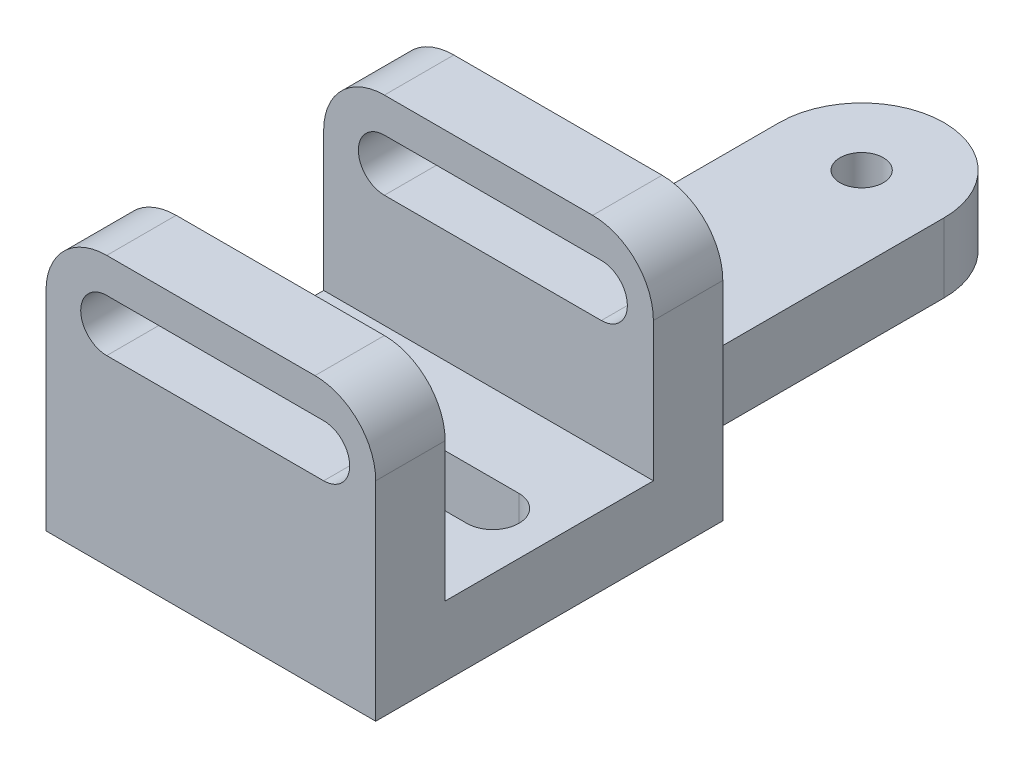
ISO-10303-21;
HEADER;
FILE_DESCRIPTION(('STEP AP214'),'2;1');
FILE_NAME('part.step','',(''),(''),'','','');
FILE_SCHEMA(('AUTOMOTIVE_DESIGN { 1 0 10303 214 1 1 1 1 }'));
ENDSEC;
DATA;
#1=APPLICATION_CONTEXT('core data for automotive mechanical design processes');
#2=APPLICATION_PROTOCOL_DEFINITION('international standard','automotive_design',2000,#1);
#3=PRODUCT_CONTEXT('',#1,'mechanical');
#4=PRODUCT('Part','Part','',(#3));
#5=PRODUCT_RELATED_PRODUCT_CATEGORY('part','',(#4));
#6=PRODUCT_DEFINITION_FORMATION('','',#4);
#7=PRODUCT_DEFINITION_CONTEXT('part definition',#1,'design');
#8=PRODUCT_DEFINITION('design','',#6,#7);
#9=PRODUCT_DEFINITION_SHAPE('','',#8);
#10=(LENGTH_UNIT() NAMED_UNIT(*) SI_UNIT(.MILLI.,.METRE.));
#11=(NAMED_UNIT(*) PLANE_ANGLE_UNIT() SI_UNIT($,.RADIAN.));
#12=(NAMED_UNIT(*) SI_UNIT($,.STERADIAN.) SOLID_ANGLE_UNIT());
#13=UNCERTAINTY_MEASURE_WITH_UNIT(LENGTH_MEASURE(1.E-05),#10,'distance_accuracy_value','');
#14=(GEOMETRIC_REPRESENTATION_CONTEXT(3) GLOBAL_UNCERTAINTY_ASSIGNED_CONTEXT((#13)) GLOBAL_UNIT_ASSIGNED_CONTEXT((#10,
#11,#12)) REPRESENTATION_CONTEXT('',''));
#15=CARTESIAN_POINT('',(0.,0.,0.));
#16=DIRECTION('',(0.,0.,1.));
#17=DIRECTION('',(1.,0.,0.));
#18=AXIS2_PLACEMENT_3D('',#15,#16,#17);
#19=CARTESIAN_POINT('',(38.,0.,-80.));
#20=DIRECTION('',(0.,0.,1.));
#21=DIRECTION('',(0.,-1.,0.));
#22=AXIS2_PLACEMENT_3D('',#19,#20,#21);
#23=PLANE('',#22);
#24=DIRECTION('',(-1.,0.,0.));
#25=VECTOR('',#24,1.);
#26=CARTESIAN_POINT('',(38.,54.,-80.));
#27=LINE('',#26,#25);
#28=CARTESIAN_POINT('',(26.,54.,-80.));
#29=VERTEX_POINT('',#28);
#30=CARTESIAN_POINT('',(-24.,54.,-80.));
#31=VERTEX_POINT('',#30);
#32=EDGE_CURVE('E312',#29,#31,#27,.T.);
#33=ORIENTED_EDGE('',*,*,#32,.T.);
#34=CARTESIAN_POINT('',(-24.,48.,-80.));
#35=DIRECTION('',(0.,0.,1.));
#36=DIRECTION('',(0.,-1.,0.));
#37=AXIS2_PLACEMENT_3D('',#34,#35,#36);
#38=CIRCLE('',#37,6.);
#39=CARTESIAN_POINT('',(-24.,42.,-80.));
#40=VERTEX_POINT('',#39);
#41=EDGE_CURVE('E320',#31,#40,#38,.T.);
#42=ORIENTED_EDGE('',*,*,#41,.T.);
#43=DIRECTION('',(1.,0.,0.));
#44=VECTOR('',#43,1.);
#45=CARTESIAN_POINT('',(38.,42.,-80.));
#46=LINE('',#45,#44);
#47=CARTESIAN_POINT('',(26.,42.,-80.));
#48=VERTEX_POINT('',#47);
#49=EDGE_CURVE('E296',#40,#48,#46,.T.);
#50=ORIENTED_EDGE('',*,*,#49,.T.);
#51=CARTESIAN_POINT('',(26.,48.,-80.));
#52=DIRECTION('',(0.,0.,1.));
#53=DIRECTION('',(0.,-1.,0.));
#54=AXIS2_PLACEMENT_3D('',#51,#52,#53);
#55=CIRCLE('',#54,6.);
#56=EDGE_CURVE('E304',#48,#29,#55,.T.);
#57=ORIENTED_EDGE('',*,*,#56,.T.);
#58=EDGE_LOOP('',(#33,#42,#50,#57));
#59=FACE_BOUND('',#58,.T.);
#60=DIRECTION('',(-1.,0.,0.));
#61=VECTOR('',#60,1.);
#62=CARTESIAN_POINT('',(-19.,16.,-80.));
#63=LINE('',#62,#61);
#64=CARTESIAN_POINT('',(33.,16.,-80.));
#65=VERTEX_POINT('',#64);
#66=CARTESIAN_POINT('',(-33.,16.,-80.));
#67=VERTEX_POINT('',#66);
#68=EDGE_CURVE('E368',#65,#67,#63,.T.);
#69=ORIENTED_EDGE('',*,*,#68,.T.);
#70=DIRECTION('',(0.,-1.,0.));
#71=VECTOR('',#70,1.);
#72=CARTESIAN_POINT('',(-33.,0.,-80.));
#73=LINE('',#72,#71);
#74=CARTESIAN_POINT('',(-33.,0.,-80.));
#75=VERTEX_POINT('',#74);
#76=EDGE_CURVE('E551',#67,#75,#73,.T.);
#77=ORIENTED_EDGE('',*,*,#76,.T.);
#78=DIRECTION('',(-1.,0.,0.));
#79=VECTOR('',#78,1.);
#80=CARTESIAN_POINT('',(38.,0.,-80.));
#81=LINE('',#80,#79);
#82=CARTESIAN_POINT('',(-38.,0.,-80.));
#83=VERTEX_POINT('',#82);
#84=EDGE_CURVE('E445',#75,#83,#81,.T.);
#85=ORIENTED_EDGE('',*,*,#84,.T.);
#86=DIRECTION('',(0.,1.,0.));
#87=VECTOR('',#86,1.);
#88=CARTESIAN_POINT('',(-38.,0.,-80.));
#89=LINE('',#88,#87);
#90=CARTESIAN_POINT('',(-38.,48.,-80.));
#91=VERTEX_POINT('',#90);
#92=EDGE_CURVE('E413',#83,#91,#89,.T.);
#93=ORIENTED_EDGE('',*,*,#92,.T.);
#94=CARTESIAN_POINT('',(-24.,48.,-80.));
#95=DIRECTION('',(0.,0.,1.));
#96=DIRECTION('',(0.,-1.,0.));
#97=AXIS2_PLACEMENT_3D('',#94,#95,#96);
#98=CIRCLE('',#97,14.);
#99=CARTESIAN_POINT('',(-24.,62.,-80.));
#100=VERTEX_POINT('',#99);
#101=EDGE_CURVE('E504',#91,#100,#98,.F.);
#102=ORIENTED_EDGE('',*,*,#101,.T.);
#103=DIRECTION('',(-1.,0.,0.));
#104=VECTOR('',#103,1.);
#105=CARTESIAN_POINT('',(38.,62.,-80.));
#106=LINE('',#105,#104);
#107=CARTESIAN_POINT('',(24.,62.,-80.));
#108=VERTEX_POINT('',#107);
#109=EDGE_CURVE('E441',#108,#100,#106,.T.);
#110=ORIENTED_EDGE('',*,*,#109,.F.);
#111=CARTESIAN_POINT('',(24.,48.,-80.));
#112=DIRECTION('',(0.,0.,1.));
#113=DIRECTION('',(0.,-1.,0.));
#114=AXIS2_PLACEMENT_3D('',#111,#112,#113);
#115=CIRCLE('',#114,14.);
#116=CARTESIAN_POINT('',(38.,48.,-80.));
#117=VERTEX_POINT('',#116);
#118=EDGE_CURVE('E501',#108,#117,#115,.F.);
#119=ORIENTED_EDGE('',*,*,#118,.T.);
#120=DIRECTION('',(0.,1.,0.));
#121=VECTOR('',#120,1.);
#122=CARTESIAN_POINT('',(38.,0.,-80.));
#123=LINE('',#122,#121);
#124=CARTESIAN_POINT('',(38.,0.,-80.));
#125=VERTEX_POINT('',#124);
#126=EDGE_CURVE('E392',#125,#117,#123,.T.);
#127=ORIENTED_EDGE('',*,*,#126,.F.);
#128=CARTESIAN_POINT('',(33.,0.,-80.));
#129=VERTEX_POINT('',#128);
#130=EDGE_CURVE('E446',#125,#129,#81,.T.);
#131=ORIENTED_EDGE('',*,*,#130,.T.);
#132=DIRECTION('',(0.,-1.,0.));
#133=VECTOR('',#132,1.);
#134=CARTESIAN_POINT('',(33.,0.,-80.));
#135=LINE('',#134,#133);
#136=EDGE_CURVE('E547',#129,#65,#135,.F.);
#137=ORIENTED_EDGE('',*,*,#136,.T.);
#138=EDGE_LOOP('',(#69,#77,#85,#93,#102,#110,#119,#127,#131,#137));
#139=FACE_BOUND('',#138,.T.);
#140=ADVANCED_FACE('F43',(#59,#139),#23,.F.);
#141=CARTESIAN_POINT('',(38.,62.,-16.));
#142=DIRECTION('',(0.,-1.,0.));
#143=DIRECTION('',(0.,0.,-1.));
#144=AXIS2_PLACEMENT_3D('',#141,#142,#143);
#145=PLANE('',#144);
#146=DIRECTION('',(-1.,0.,0.));
#147=VECTOR('',#146,1.);
#148=CARTESIAN_POINT('',(38.,62.,-16.));
#149=LINE('',#148,#147);
#150=CARTESIAN_POINT('',(24.,62.,-16.));
#151=VERTEX_POINT('',#150);
#152=CARTESIAN_POINT('',(-24.,62.,-16.));
#153=VERTEX_POINT('',#152);
#154=EDGE_CURVE('E406',#151,#153,#149,.T.);
#155=ORIENTED_EDGE('',*,*,#154,.T.);
#156=DIRECTION('',(0.,0.,1.));
#157=VECTOR('',#156,1.);
#158=CARTESIAN_POINT('',(-24.,62.,-16.));
#159=LINE('',#158,#157);
#160=CARTESIAN_POINT('',(-24.,62.,0.));
#161=VERTEX_POINT('',#160);
#162=EDGE_CURVE('E510',#153,#161,#159,.T.);
#163=ORIENTED_EDGE('',*,*,#162,.T.);
#164=DIRECTION('',(-1.,0.,0.));
#165=VECTOR('',#164,1.);
#166=CARTESIAN_POINT('',(38.,62.,0.));
#167=LINE('',#166,#165);
#168=CARTESIAN_POINT('',(24.,62.,0.));
#169=VERTEX_POINT('',#168);
#170=EDGE_CURVE('E454',#169,#161,#167,.T.);
#171=ORIENTED_EDGE('',*,*,#170,.F.);
#172=DIRECTION('',(0.,0.,1.));
#173=VECTOR('',#172,1.);
#174=CARTESIAN_POINT('',(24.,62.,-16.));
#175=LINE('',#174,#173);
#176=EDGE_CURVE('E507',#169,#151,#175,.F.);
#177=ORIENTED_EDGE('',*,*,#176,.T.);
#178=EDGE_LOOP('',(#155,#163,#171,#177));
#179=FACE_BOUND('',#178,.T.);
#180=ADVANCED_FACE('F626',(#179),#145,.F.);
#181=CARTESIAN_POINT('',(38.,62.,0.));
#182=DIRECTION('',(0.,0.,-1.));
#183=DIRECTION('',(-1.,0.,0.));
#184=AXIS2_PLACEMENT_3D('',#181,#182,#183);
#185=PLANE('',#184);
#186=DIRECTION('',(1.,0.,0.));
#187=VECTOR('',#186,1.);
#188=CARTESIAN_POINT('',(-24.,42.,0.));
#189=LINE('',#188,#187);
#190=CARTESIAN_POINT('',(-24.,42.,0.));
#191=VERTEX_POINT('',#190);
#192=CARTESIAN_POINT('',(26.,42.,0.));
#193=VERTEX_POINT('',#192);
#194=EDGE_CURVE('E263',#191,#193,#189,.T.);
#195=ORIENTED_EDGE('',*,*,#194,.F.);
#196=CARTESIAN_POINT('',(-24.,48.,0.));
#197=DIRECTION('',(0.,0.,1.));
#198=DIRECTION('',(1.,0.,0.));
#199=AXIS2_PLACEMENT_3D('',#196,#197,#198);
#200=CIRCLE('',#199,6.);
#201=CARTESIAN_POINT('',(-24.,54.,0.));
#202=VERTEX_POINT('',#201);
#203=EDGE_CURVE('E270',#202,#191,#200,.T.);
#204=ORIENTED_EDGE('',*,*,#203,.F.);
#205=DIRECTION('',(-1.,0.,0.));
#206=VECTOR('',#205,1.);
#207=CARTESIAN_POINT('',(-24.,54.,0.));
#208=LINE('',#207,#206);
#209=CARTESIAN_POINT('',(26.,54.,0.));
#210=VERTEX_POINT('',#209);
#211=EDGE_CURVE('E275',#210,#202,#208,.T.);
#212=ORIENTED_EDGE('',*,*,#211,.F.);
#213=CARTESIAN_POINT('',(26.,48.,0.));
#214=DIRECTION('',(0.,0.,1.));
#215=DIRECTION('',(1.,0.,0.));
#216=AXIS2_PLACEMENT_3D('',#213,#214,#215);
#217=CIRCLE('',#216,6.);
#218=EDGE_CURVE('E251',#193,#210,#217,.T.);
#219=ORIENTED_EDGE('',*,*,#218,.F.);
#220=EDGE_LOOP('',(#195,#204,#212,#219));
#221=FACE_BOUND('',#220,.T.);
#222=ORIENTED_EDGE('',*,*,#170,.T.);
#223=CARTESIAN_POINT('',(-24.,48.,0.));
#224=DIRECTION('',(0.,0.,-1.));
#225=DIRECTION('',(-1.,0.,0.));
#226=AXIS2_PLACEMENT_3D('',#223,#224,#225);
#227=CIRCLE('',#226,14.);
#228=CARTESIAN_POINT('',(-38.,48.,0.));
#229=VERTEX_POINT('',#228);
#230=EDGE_CURVE('E517',#161,#229,#227,.F.);
#231=ORIENTED_EDGE('',*,*,#230,.T.);
#232=DIRECTION('',(0.,-1.,0.));
#233=VECTOR('',#232,1.);
#234=CARTESIAN_POINT('',(-38.,62.,0.));
#235=LINE('',#234,#233);
#236=CARTESIAN_POINT('',(-38.,0.,0.));
#237=VERTEX_POINT('',#236);
#238=EDGE_CURVE('E378',#229,#237,#235,.T.);
#239=ORIENTED_EDGE('',*,*,#238,.T.);
#240=DIRECTION('',(-1.,0.,0.));
#241=VECTOR('',#240,1.);
#242=CARTESIAN_POINT('',(38.,0.,0.));
#243=LINE('',#242,#241);
#244=CARTESIAN_POINT('',(38.,0.,0.));
#245=VERTEX_POINT('',#244);
#246=EDGE_CURVE('E450',#245,#237,#243,.T.);
#247=ORIENTED_EDGE('',*,*,#246,.F.);
#248=DIRECTION('',(0.,-1.,0.));
#249=VECTOR('',#248,1.);
#250=CARTESIAN_POINT('',(38.,62.,0.));
#251=LINE('',#250,#249);
#252=CARTESIAN_POINT('',(38.,48.,0.));
#253=VERTEX_POINT('',#252);
#254=EDGE_CURVE('E385',#253,#245,#251,.T.);
#255=ORIENTED_EDGE('',*,*,#254,.F.);
#256=CARTESIAN_POINT('',(24.,48.,0.));
#257=DIRECTION('',(0.,0.,-1.));
#258=DIRECTION('',(-1.,0.,0.));
#259=AXIS2_PLACEMENT_3D('',#256,#257,#258);
#260=CIRCLE('',#259,14.);
#261=EDGE_CURVE('E514',#253,#169,#260,.F.);
#262=ORIENTED_EDGE('',*,*,#261,.T.);
#263=EDGE_LOOP('',(#222,#231,#239,#247,#255,#262));
#264=FACE_BOUND('',#263,.T.);
#265=ADVANCED_FACE('F272',(#221,#264),#185,.F.);
#266=CARTESIAN_POINT('',(38.,0.,0.));
#267=DIRECTION('',(0.,1.,0.));
#268=DIRECTION('',(0.,0.,1.));
#269=AXIS2_PLACEMENT_3D('',#266,#267,#268);
#270=PLANE('',#269);
#271=CARTESIAN_POINT('',(0.,0.,-150.));
#272=DIRECTION('',(0.,1.,0.));
#273=DIRECTION('',(0.,0.,1.));
#274=AXIS2_PLACEMENT_3D('',#271,#272,#273);
#275=CIRCLE('',#274,5.);
#276=CARTESIAN_POINT('',(0.,0.,-145.));
#277=VERTEX_POINT('',#276);
#278=EDGE_CURVE('E1031',#277,#277,#275,.T.);
#279=ORIENTED_EDGE('',*,*,#278,.T.);
#280=EDGE_LOOP('',(#279));
#281=FACE_BOUND('',#280,.T.);
#282=DIRECTION('',(-1.,0.,0.));
#283=VECTOR('',#282,1.);
#284=CARTESIAN_POINT('',(25.,0.,-34.));
#285=LINE('',#284,#283);
#286=CARTESIAN_POINT('',(25.,0.,-34.));
#287=VERTEX_POINT('',#286);
#288=CARTESIAN_POINT('',(-25.,0.,-34.));
#289=VERTEX_POINT('',#288);
#290=EDGE_CURVE('E327',#287,#289,#285,.T.);
#291=ORIENTED_EDGE('',*,*,#290,.F.);
#292=CARTESIAN_POINT('',(25.,0.,-40.));
#293=DIRECTION('',(0.,1.,0.));
#294=DIRECTION('',(0.,0.,1.));
#295=AXIS2_PLACEMENT_3D('',#292,#293,#294);
#296=CIRCLE('',#295,6.);
#297=CARTESIAN_POINT('',(25.,0.,-46.));
#298=VERTEX_POINT('',#297);
#299=EDGE_CURVE('E331',#298,#287,#296,.F.);
#300=ORIENTED_EDGE('',*,*,#299,.F.);
#301=DIRECTION('',(1.,0.,0.));
#302=VECTOR('',#301,1.);
#303=CARTESIAN_POINT('',(25.,0.,-46.));
#304=LINE('',#303,#302);
#305=CARTESIAN_POINT('',(-25.,0.,-46.));
#306=VERTEX_POINT('',#305);
#307=EDGE_CURVE('E354',#306,#298,#304,.T.);
#308=ORIENTED_EDGE('',*,*,#307,.F.);
#309=CARTESIAN_POINT('',(-25.,0.,-40.));
#310=DIRECTION('',(0.,1.,0.));
#311=DIRECTION('',(0.,0.,1.));
#312=AXIS2_PLACEMENT_3D('',#309,#310,#311);
#313=CIRCLE('',#312,5.99999999999999);
#314=EDGE_CURVE('E324',#289,#306,#313,.F.);
#315=ORIENTED_EDGE('',*,*,#314,.F.);
#316=EDGE_LOOP('',(#291,#300,#308,#315));
#317=FACE_BOUND('',#316,.T.);
#318=CARTESIAN_POINT('',(0.,0.,-150.));
#319=DIRECTION('',(0.,1.,0.));
#320=DIRECTION('',(0.,0.,1.));
#321=AXIS2_PLACEMENT_3D('',#318,#319,#320);
#322=CIRCLE('',#321,19.);
#323=CARTESIAN_POINT('',(-19.,0.,-150.));
#324=VERTEX_POINT('',#323);
#325=CARTESIAN_POINT('',(0.,0.,-169.));
#326=VERTEX_POINT('',#325);
#327=EDGE_CURVE('E458',#324,#326,#322,.F.);
#328=ORIENTED_EDGE('',*,*,#327,.T.);
#329=CARTESIAN_POINT('',(0.,0.,-150.));
#330=DIRECTION('',(0.,1.,0.));
#331=DIRECTION('',(0.,0.,1.));
#332=AXIS2_PLACEMENT_3D('',#329,#330,#331);
#333=CIRCLE('',#332,19.);
#334=CARTESIAN_POINT('',(19.,0.,-150.));
#335=VERTEX_POINT('',#334);
#336=EDGE_CURVE('E461',#326,#335,#333,.F.);
#337=ORIENTED_EDGE('',*,*,#336,.T.);
#338=DIRECTION('',(0.,0.,1.));
#339=VECTOR('',#338,1.);
#340=CARTESIAN_POINT('',(19.,0.,-80.));
#341=LINE('',#340,#339);
#342=CARTESIAN_POINT('',(19.,0.,-94.));
#343=VERTEX_POINT('',#342);
#344=EDGE_CURVE('E372',#335,#343,#341,.T.);
#345=ORIENTED_EDGE('',*,*,#344,.T.);
#346=CARTESIAN_POINT('',(33.,0.,-94.));
#347=DIRECTION('',(0.,1.,0.));
#348=DIRECTION('',(0.,0.,1.));
#349=AXIS2_PLACEMENT_3D('',#346,#347,#348);
#350=CIRCLE('',#349,14.);
#351=EDGE_CURVE('E52',#343,#129,#350,.T.);
#352=ORIENTED_EDGE('',*,*,#351,.T.);
#353=ORIENTED_EDGE('',*,*,#130,.F.);
#354=DIRECTION('',(0.,0.,-1.));
#355=VECTOR('',#354,1.);
#356=CARTESIAN_POINT('',(38.,0.,0.));
#357=LINE('',#356,#355);
#358=EDGE_CURVE('E388',#245,#125,#357,.T.);
#359=ORIENTED_EDGE('',*,*,#358,.F.);
#360=ORIENTED_EDGE('',*,*,#246,.T.);
#361=DIRECTION('',(0.,0.,-1.));
#362=VECTOR('',#361,1.);
#363=CARTESIAN_POINT('',(-38.,0.,0.));
#364=LINE('',#363,#362);
#365=EDGE_CURVE('E409',#237,#83,#364,.T.);
#366=ORIENTED_EDGE('',*,*,#365,.T.);
#367=ORIENTED_EDGE('',*,*,#84,.F.);
#368=CARTESIAN_POINT('',(-33.,0.,-94.));
#369=DIRECTION('',(0.,1.,0.));
#370=DIRECTION('',(0.,0.,1.));
#371=AXIS2_PLACEMENT_3D('',#368,#369,#370);
#372=CIRCLE('',#371,14.);
#373=CARTESIAN_POINT('',(-19.,0.,-94.));
#374=VERTEX_POINT('',#373);
#375=EDGE_CURVE('E561',#75,#374,#372,.T.);
#376=ORIENTED_EDGE('',*,*,#375,.T.);
#377=DIRECTION('',(0.,0.,-1.));
#378=VECTOR('',#377,1.);
#379=CARTESIAN_POINT('',(-19.,0.,-80.));
#380=LINE('',#379,#378);
#381=EDGE_CURVE('E379',#374,#324,#380,.T.);
#382=ORIENTED_EDGE('',*,*,#381,.T.);
#383=EDGE_LOOP('',(#328,#337,#345,#352,#353,#359,#360,#366,#367,#376,#382));
#384=FACE_BOUND('',#383,.T.);
#385=ADVANCED_FACE('F570',(#281,#317,#384),#270,.F.);
#386=CARTESIAN_POINT('',(38.,62.,-80.));
#387=DIRECTION('',(0.,-1.,0.));
#388=DIRECTION('',(0.,0.,-1.));
#389=AXIS2_PLACEMENT_3D('',#386,#387,#388);
#390=PLANE('',#389);
#391=ORIENTED_EDGE('',*,*,#109,.T.);
#392=DIRECTION('',(0.,0.,1.));
#393=VECTOR('',#392,1.);
#394=CARTESIAN_POINT('',(-24.,62.,-80.));
#395=LINE('',#394,#393);
#396=CARTESIAN_POINT('',(-24.,62.,-64.));
#397=VERTEX_POINT('',#396);
#398=EDGE_CURVE('E485',#100,#397,#395,.T.);
#399=ORIENTED_EDGE('',*,*,#398,.T.);
#400=DIRECTION('',(-1.,0.,0.));
#401=VECTOR('',#400,1.);
#402=CARTESIAN_POINT('',(38.,62.,-64.));
#403=LINE('',#402,#401);
#404=CARTESIAN_POINT('',(24.,62.,-64.));
#405=VERTEX_POINT('',#404);
#406=EDGE_CURVE('E437',#405,#397,#403,.T.);
#407=ORIENTED_EDGE('',*,*,#406,.F.);
#408=DIRECTION('',(0.,0.,1.));
#409=VECTOR('',#408,1.);
#410=CARTESIAN_POINT('',(24.,62.,-80.));
#411=LINE('',#410,#409);
#412=EDGE_CURVE('E479',#405,#108,#411,.F.);
#413=ORIENTED_EDGE('',*,*,#412,.T.);
#414=EDGE_LOOP('',(#391,#399,#407,#413));
#415=FACE_BOUND('',#414,.T.);
#416=ADVANCED_FACE('F635',(#415),#390,.F.);
#417=CARTESIAN_POINT('',(38.,62.,-64.));
#418=DIRECTION('',(0.,0.,-1.));
#419=DIRECTION('',(-1.,0.,0.));
#420=AXIS2_PLACEMENT_3D('',#417,#418,#419);
#421=PLANE('',#420);
#422=DIRECTION('',(-1.,0.,0.));
#423=VECTOR('',#422,1.);
#424=CARTESIAN_POINT('',(38.,42.,-64.));
#425=LINE('',#424,#423);
#426=CARTESIAN_POINT('',(26.,42.,-64.));
#427=VERTEX_POINT('',#426);
#428=CARTESIAN_POINT('',(-24.,42.,-64.));
#429=VERTEX_POINT('',#428);
#430=EDGE_CURVE('E292',#427,#429,#425,.T.);
#431=ORIENTED_EDGE('',*,*,#430,.T.);
#432=CARTESIAN_POINT('',(-24.,48.,-64.));
#433=DIRECTION('',(0.,0.,-1.));
#434=DIRECTION('',(-1.,0.,0.));
#435=AXIS2_PLACEMENT_3D('',#432,#433,#434);
#436=CIRCLE('',#435,6.);
#437=CARTESIAN_POINT('',(-24.,54.,-64.));
#438=VERTEX_POINT('',#437);
#439=EDGE_CURVE('E316',#429,#438,#436,.T.);
#440=ORIENTED_EDGE('',*,*,#439,.T.);
#441=DIRECTION('',(1.,0.,0.));
#442=VECTOR('',#441,1.);
#443=CARTESIAN_POINT('',(38.,54.,-64.));
#444=LINE('',#443,#442);
#445=CARTESIAN_POINT('',(26.,54.,-64.));
#446=VERTEX_POINT('',#445);
#447=EDGE_CURVE('E308',#438,#446,#444,.T.);
#448=ORIENTED_EDGE('',*,*,#447,.T.);
#449=CARTESIAN_POINT('',(26.,48.,-64.));
#450=DIRECTION('',(0.,0.,-1.));
#451=DIRECTION('',(-1.,0.,0.));
#452=AXIS2_PLACEMENT_3D('',#449,#450,#451);
#453=CIRCLE('',#452,6.);
#454=EDGE_CURVE('E300',#446,#427,#453,.T.);
#455=ORIENTED_EDGE('',*,*,#454,.T.);
#456=EDGE_LOOP('',(#431,#440,#448,#455));
#457=FACE_BOUND('',#456,.T.);
#458=ORIENTED_EDGE('',*,*,#406,.T.);
#459=CARTESIAN_POINT('',(-24.,48.,-64.));
#460=DIRECTION('',(0.,0.,-1.));
#461=DIRECTION('',(-1.,0.,0.));
#462=AXIS2_PLACEMENT_3D('',#459,#460,#461);
#463=CIRCLE('',#462,14.);
#464=CARTESIAN_POINT('',(-38.,48.,-64.));
#465=VERTEX_POINT('',#464);
#466=EDGE_CURVE('E492',#397,#465,#463,.F.);
#467=ORIENTED_EDGE('',*,*,#466,.T.);
#468=DIRECTION('',(0.,-1.,0.));
#469=VECTOR('',#468,1.);
#470=CARTESIAN_POINT('',(-38.,62.,-64.));
#471=LINE('',#470,#469);
#472=CARTESIAN_POINT('',(-38.,16.,-64.));
#473=VERTEX_POINT('',#472);
#474=EDGE_CURVE('E417',#465,#473,#471,.T.);
#475=ORIENTED_EDGE('',*,*,#474,.T.);
#476=DIRECTION('',(-1.,0.,0.));
#477=VECTOR('',#476,1.);
#478=CARTESIAN_POINT('',(38.,16.,-64.));
#479=LINE('',#478,#477);
#480=CARTESIAN_POINT('',(38.,16.,-64.));
#481=VERTEX_POINT('',#480);
#482=EDGE_CURVE('E433',#481,#473,#479,.T.);
#483=ORIENTED_EDGE('',*,*,#482,.F.);
#484=DIRECTION('',(0.,-1.,0.));
#485=VECTOR('',#484,1.);
#486=CARTESIAN_POINT('',(38.,62.,-64.));
#487=LINE('',#486,#485);
#488=CARTESIAN_POINT('',(38.,48.,-64.));
#489=VERTEX_POINT('',#488);
#490=EDGE_CURVE('E396',#489,#481,#487,.T.);
#491=ORIENTED_EDGE('',*,*,#490,.F.);
#492=CARTESIAN_POINT('',(24.,48.,-64.));
#493=DIRECTION('',(0.,0.,-1.));
#494=DIRECTION('',(-1.,0.,0.));
#495=AXIS2_PLACEMENT_3D('',#492,#493,#494);
#496=CIRCLE('',#495,14.);
#497=EDGE_CURVE('E489',#489,#405,#496,.F.);
#498=ORIENTED_EDGE('',*,*,#497,.T.);
#499=EDGE_LOOP('',(#458,#467,#475,#483,#491,#498));
#500=FACE_BOUND('',#499,.T.);
#501=ADVANCED_FACE('F616',(#457,#500),#421,.F.);
#502=CARTESIAN_POINT('',(38.,16.,-64.));
#503=DIRECTION('',(0.,-1.,0.));
#504=DIRECTION('',(0.,0.,-1.));
#505=AXIS2_PLACEMENT_3D('',#502,#503,#504);
#506=PLANE('',#505);
#507=DIRECTION('',(-1.,0.,0.));
#508=VECTOR('',#507,1.);
#509=CARTESIAN_POINT('',(25.,16.,-46.));
#510=LINE('',#509,#508);
#511=CARTESIAN_POINT('',(25.,16.,-46.));
#512=VERTEX_POINT('',#511);
#513=CARTESIAN_POINT('',(-25.,16.,-46.));
#514=VERTEX_POINT('',#513);
#515=EDGE_CURVE('E338',#512,#514,#510,.T.);
#516=ORIENTED_EDGE('',*,*,#515,.F.);
#517=CARTESIAN_POINT('',(25.,16.,-40.));
#518=DIRECTION('',(0.,1.,0.));
#519=DIRECTION('',(0.,0.,1.));
#520=AXIS2_PLACEMENT_3D('',#517,#518,#519);
#521=CIRCLE('',#520,6.);
#522=CARTESIAN_POINT('',(25.,16.,-34.));
#523=VERTEX_POINT('',#522);
#524=EDGE_CURVE('E335',#523,#512,#521,.T.);
#525=ORIENTED_EDGE('',*,*,#524,.F.);
#526=DIRECTION('',(1.,0.,0.));
#527=VECTOR('',#526,1.);
#528=CARTESIAN_POINT('',(25.,16.,-34.));
#529=LINE('',#528,#527);
#530=CARTESIAN_POINT('',(-25.,16.,-34.));
#531=VERTEX_POINT('',#530);
#532=EDGE_CURVE('E346',#531,#523,#529,.T.);
#533=ORIENTED_EDGE('',*,*,#532,.F.);
#534=CARTESIAN_POINT('',(-25.,16.,-40.));
#535=DIRECTION('',(0.,1.,0.));
#536=DIRECTION('',(0.,0.,1.));
#537=AXIS2_PLACEMENT_3D('',#534,#535,#536);
#538=CIRCLE('',#537,5.99999999999999);
#539=EDGE_CURVE('E342',#514,#531,#538,.T.);
#540=ORIENTED_EDGE('',*,*,#539,.F.);
#541=EDGE_LOOP('',(#516,#525,#533,#540));
#542=FACE_BOUND('',#541,.T.);
#543=DIRECTION('',(0.,0.,1.));
#544=VECTOR('',#543,1.);
#545=CARTESIAN_POINT('',(-38.,16.,-64.));
#546=LINE('',#545,#544);
#547=CARTESIAN_POINT('',(-38.,16.,-16.));
#548=VERTEX_POINT('',#547);
#549=EDGE_CURVE('E420',#473,#548,#546,.T.);
#550=ORIENTED_EDGE('',*,*,#549,.T.);
#551=DIRECTION('',(-1.,0.,0.));
#552=VECTOR('',#551,1.);
#553=CARTESIAN_POINT('',(38.,16.,-16.));
#554=LINE('',#553,#552);
#555=CARTESIAN_POINT('',(38.,16.,-16.));
#556=VERTEX_POINT('',#555);
#557=EDGE_CURVE('E429',#556,#548,#554,.T.);
#558=ORIENTED_EDGE('',*,*,#557,.F.);
#559=DIRECTION('',(0.,0.,1.));
#560=VECTOR('',#559,1.);
#561=CARTESIAN_POINT('',(38.,16.,-64.));
#562=LINE('',#561,#560);
#563=EDGE_CURVE('E399',#481,#556,#562,.T.);
#564=ORIENTED_EDGE('',*,*,#563,.F.);
#565=ORIENTED_EDGE('',*,*,#482,.T.);
#566=EDGE_LOOP('',(#550,#558,#564,#565));
#567=FACE_BOUND('',#566,.T.);
#568=ADVANCED_FACE('F718',(#542,#567),#506,.F.);
#569=CARTESIAN_POINT('',(38.,16.,-16.));
#570=DIRECTION('',(0.,0.,1.));
#571=DIRECTION('',(0.,-1.,0.));
#572=AXIS2_PLACEMENT_3D('',#569,#570,#571);
#573=PLANE('',#572);
#574=DIRECTION('',(-1.,0.,0.));
#575=VECTOR('',#574,1.);
#576=CARTESIAN_POINT('',(38.,54.,-16.));
#577=LINE('',#576,#575);
#578=CARTESIAN_POINT('',(26.,54.,-16.));
#579=VERTEX_POINT('',#578);
#580=CARTESIAN_POINT('',(-24.,54.,-16.));
#581=VERTEX_POINT('',#580);
#582=EDGE_CURVE('E539',#579,#581,#577,.T.);
#583=ORIENTED_EDGE('',*,*,#582,.T.);
#584=CARTESIAN_POINT('',(-24.,48.,-16.));
#585=DIRECTION('',(0.,0.,1.));
#586=DIRECTION('',(0.,-1.,0.));
#587=AXIS2_PLACEMENT_3D('',#584,#585,#586);
#588=CIRCLE('',#587,6.);
#589=CARTESIAN_POINT('',(-24.,42.,-16.));
#590=VERTEX_POINT('',#589);
#591=EDGE_CURVE('E543',#581,#590,#588,.T.);
#592=ORIENTED_EDGE('',*,*,#591,.T.);
#593=DIRECTION('',(1.,0.,0.));
#594=VECTOR('',#593,1.);
#595=CARTESIAN_POINT('',(38.,42.,-16.));
#596=LINE('',#595,#594);
#597=CARTESIAN_POINT('',(26.,42.,-16.));
#598=VERTEX_POINT('',#597);
#599=EDGE_CURVE('E534',#590,#598,#596,.T.);
#600=ORIENTED_EDGE('',*,*,#599,.T.);
#601=CARTESIAN_POINT('',(26.,48.,-16.));
#602=DIRECTION('',(0.,0.,1.));
#603=DIRECTION('',(0.,-1.,0.));
#604=AXIS2_PLACEMENT_3D('',#601,#602,#603);
#605=CIRCLE('',#604,6.);
#606=EDGE_CURVE('E254',#598,#579,#605,.T.);
#607=ORIENTED_EDGE('',*,*,#606,.T.);
#608=EDGE_LOOP('',(#583,#592,#600,#607));
#609=FACE_BOUND('',#608,.T.);
#610=DIRECTION('',(0.,1.,0.));
#611=VECTOR('',#610,1.);
#612=CARTESIAN_POINT('',(-38.,16.,-16.));
#613=LINE('',#612,#611);
#614=CARTESIAN_POINT('',(-38.,48.,-16.));
#615=VERTEX_POINT('',#614);
#616=EDGE_CURVE('E389',#548,#615,#613,.T.);
#617=ORIENTED_EDGE('',*,*,#616,.T.);
#618=CARTESIAN_POINT('',(-24.,48.,-16.));
#619=DIRECTION('',(0.,0.,1.));
#620=DIRECTION('',(0.,-1.,0.));
#621=AXIS2_PLACEMENT_3D('',#618,#619,#620);
#622=CIRCLE('',#621,14.);
#623=EDGE_CURVE('E523',#615,#153,#622,.F.);
#624=ORIENTED_EDGE('',*,*,#623,.T.);
#625=ORIENTED_EDGE('',*,*,#154,.F.);
#626=CARTESIAN_POINT('',(24.,48.,-16.));
#627=DIRECTION('',(0.,0.,1.));
#628=DIRECTION('',(0.,-1.,0.));
#629=AXIS2_PLACEMENT_3D('',#626,#627,#628);
#630=CIRCLE('',#629,14.);
#631=CARTESIAN_POINT('',(38.,48.,-16.));
#632=VERTEX_POINT('',#631);
#633=EDGE_CURVE('E520',#151,#632,#630,.F.);
#634=ORIENTED_EDGE('',*,*,#633,.T.);
#635=DIRECTION('',(0.,1.,0.));
#636=VECTOR('',#635,1.);
#637=CARTESIAN_POINT('',(38.,16.,-16.));
#638=LINE('',#637,#636);
#639=EDGE_CURVE('E402',#556,#632,#638,.T.);
#640=ORIENTED_EDGE('',*,*,#639,.F.);
#641=ORIENTED_EDGE('',*,*,#557,.T.);
#642=EDGE_LOOP('',(#617,#624,#625,#634,#640,#641));
#643=FACE_BOUND('',#642,.T.);
#644=ADVANCED_FACE('F711',(#609,#643),#573,.F.);
#645=CARTESIAN_POINT('',(38.,0.,0.));
#646=DIRECTION('',(1.,0.,0.));
#647=DIRECTION('',(0.,0.,-1.));
#648=AXIS2_PLACEMENT_3D('',#645,#646,#647);
#649=PLANE('',#648);
#650=ORIENTED_EDGE('',*,*,#126,.T.);
#651=DIRECTION('',(0.,0.,1.));
#652=VECTOR('',#651,1.);
#653=CARTESIAN_POINT('',(38.,48.,-64.));
#654=LINE('',#653,#652);
#655=EDGE_CURVE('E530',#117,#489,#654,.T.);
#656=ORIENTED_EDGE('',*,*,#655,.T.);
#657=ORIENTED_EDGE('',*,*,#490,.T.);
#658=ORIENTED_EDGE('',*,*,#563,.T.);
#659=ORIENTED_EDGE('',*,*,#639,.T.);
#660=DIRECTION('',(0.,0.,1.));
#661=VECTOR('',#660,1.);
#662=CARTESIAN_POINT('',(38.,48.,0.));
#663=LINE('',#662,#661);
#664=EDGE_CURVE('E526',#632,#253,#663,.T.);
#665=ORIENTED_EDGE('',*,*,#664,.T.);
#666=ORIENTED_EDGE('',*,*,#254,.T.);
#667=ORIENTED_EDGE('',*,*,#358,.T.);
#668=EDGE_LOOP('',(#650,#656,#657,#658,#659,#665,#666,#667));
#669=FACE_BOUND('',#668,.T.);
#670=ADVANCED_FACE('F708',(#669),#649,.T.);
#671=CARTESIAN_POINT('',(-38.,0.,0.));
#672=DIRECTION('',(1.,0.,0.));
#673=DIRECTION('',(0.,0.,-1.));
#674=AXIS2_PLACEMENT_3D('',#671,#672,#673);
#675=PLANE('',#674);
#676=ORIENTED_EDGE('',*,*,#474,.F.);
#677=DIRECTION('',(0.,0.,1.));
#678=VECTOR('',#677,1.);
#679=CARTESIAN_POINT('',(-38.,48.,0.));
#680=LINE('',#679,#678);
#681=EDGE_CURVE('E498',#465,#91,#680,.F.);
#682=ORIENTED_EDGE('',*,*,#681,.T.);
#683=ORIENTED_EDGE('',*,*,#92,.F.);
#684=ORIENTED_EDGE('',*,*,#365,.F.);
#685=ORIENTED_EDGE('',*,*,#238,.F.);
#686=DIRECTION('',(0.,0.,1.));
#687=VECTOR('',#686,1.);
#688=CARTESIAN_POINT('',(-38.,48.,0.));
#689=LINE('',#688,#687);
#690=EDGE_CURVE('E495',#229,#615,#689,.F.);
#691=ORIENTED_EDGE('',*,*,#690,.T.);
#692=ORIENTED_EDGE('',*,*,#616,.F.);
#693=ORIENTED_EDGE('',*,*,#549,.F.);
#694=EDGE_LOOP('',(#676,#682,#683,#684,#685,#691,#692,#693));
#695=FACE_BOUND('',#694,.T.);
#696=ADVANCED_FACE('F705',(#695),#675,.F.);
#697=CARTESIAN_POINT('',(19.,16.,-80.));
#698=DIRECTION('',(1.,0.,0.));
#699=DIRECTION('',(0.,0.,-1.));
#700=AXIS2_PLACEMENT_3D('',#697,#698,#699);
#701=PLANE('',#700);
#702=DIRECTION('',(0.,0.,1.));
#703=VECTOR('',#702,1.);
#704=CARTESIAN_POINT('',(19.,16.,-80.));
#705=LINE('',#704,#703);
#706=CARTESIAN_POINT('',(19.,16.,-150.));
#707=VERTEX_POINT('',#706);
#708=CARTESIAN_POINT('',(19.,16.,-94.));
#709=VERTEX_POINT('',#708);
#710=EDGE_CURVE('E375',#707,#709,#705,.T.);
#711=ORIENTED_EDGE('',*,*,#710,.T.);
#712=DIRECTION('',(0.,-1.,0.));
#713=VECTOR('',#712,1.);
#714=CARTESIAN_POINT('',(19.,16.,-94.));
#715=LINE('',#714,#713);
#716=EDGE_CURVE('E558',#709,#343,#715,.T.);
#717=ORIENTED_EDGE('',*,*,#716,.T.);
#718=ORIENTED_EDGE('',*,*,#344,.F.);
#719=DIRECTION('',(0.,-1.,0.));
#720=VECTOR('',#719,1.);
#721=CARTESIAN_POINT('',(19.,16.,-150.));
#722=LINE('',#721,#720);
#723=EDGE_CURVE('E464',#335,#707,#722,.F.);
#724=ORIENTED_EDGE('',*,*,#723,.T.);
#725=EDGE_LOOP('',(#711,#717,#718,#724));
#726=FACE_BOUND('',#725,.T.);
#727=ADVANCED_FACE('F576',(#726),#701,.T.);
#728=CARTESIAN_POINT('',(-19.,16.,-80.));
#729=DIRECTION('',(-1.,0.,0.));
#730=DIRECTION('',(0.,0.,1.));
#731=AXIS2_PLACEMENT_3D('',#728,#729,#730);
#732=PLANE('',#731);
#733=ORIENTED_EDGE('',*,*,#381,.F.);
#734=DIRECTION('',(0.,-1.,0.));
#735=VECTOR('',#734,1.);
#736=CARTESIAN_POINT('',(-19.,16.,-94.));
#737=LINE('',#736,#735);
#738=CARTESIAN_POINT('',(-19.,16.,-94.));
#739=VERTEX_POINT('',#738);
#740=EDGE_CURVE('E555',#374,#739,#737,.F.);
#741=ORIENTED_EDGE('',*,*,#740,.T.);
#742=DIRECTION('',(0.,0.,-1.));
#743=VECTOR('',#742,1.);
#744=CARTESIAN_POINT('',(-19.,16.,-80.));
#745=LINE('',#744,#743);
#746=CARTESIAN_POINT('',(-19.,16.,-150.));
#747=VERTEX_POINT('',#746);
#748=EDGE_CURVE('E371',#739,#747,#745,.T.);
#749=ORIENTED_EDGE('',*,*,#748,.T.);
#750=DIRECTION('',(0.,-1.,0.));
#751=VECTOR('',#750,1.);
#752=CARTESIAN_POINT('',(-19.,16.,-150.));
#753=LINE('',#752,#751);
#754=EDGE_CURVE('E475',#747,#324,#753,.T.);
#755=ORIENTED_EDGE('',*,*,#754,.T.);
#756=EDGE_LOOP('',(#733,#741,#749,#755));
#757=FACE_BOUND('',#756,.T.);
#758=ADVANCED_FACE('F593',(#757),#732,.T.);
#759=CARTESIAN_POINT('',(0.,16.,0.));
#760=DIRECTION('',(0.,1.,0.));
#761=DIRECTION('',(0.,0.,1.));
#762=AXIS2_PLACEMENT_3D('',#759,#760,#761);
#763=PLANE('',#762);
#764=CARTESIAN_POINT('',(0.,16.,-150.));
#765=DIRECTION('',(0.,1.,0.));
#766=DIRECTION('',(0.,0.,1.));
#767=AXIS2_PLACEMENT_3D('',#764,#765,#766);
#768=CIRCLE('',#767,5.);
#769=CARTESIAN_POINT('',(0.,16.,-145.));
#770=VERTEX_POINT('',#769);
#771=EDGE_CURVE('E1034',#770,#770,#768,.T.);
#772=ORIENTED_EDGE('',*,*,#771,.F.);
#773=EDGE_LOOP('',(#772));
#774=FACE_BOUND('',#773,.T.);
#775=ORIENTED_EDGE('',*,*,#710,.F.);
#776=CARTESIAN_POINT('',(0.,16.,-150.));
#777=DIRECTION('',(0.,1.,0.));
#778=DIRECTION('',(0.,0.,1.));
#779=AXIS2_PLACEMENT_3D('',#776,#777,#778);
#780=CIRCLE('',#779,19.);
#781=CARTESIAN_POINT('',(0.,16.,-169.));
#782=VERTEX_POINT('',#781);
#783=EDGE_CURVE('E472',#707,#782,#780,.T.);
#784=ORIENTED_EDGE('',*,*,#783,.T.);
#785=CARTESIAN_POINT('',(0.,16.,-150.));
#786=DIRECTION('',(0.,1.,0.));
#787=DIRECTION('',(0.,0.,1.));
#788=AXIS2_PLACEMENT_3D('',#785,#786,#787);
#789=CIRCLE('',#788,19.);
#790=EDGE_CURVE('E468',#782,#747,#789,.T.);
#791=ORIENTED_EDGE('',*,*,#790,.T.);
#792=ORIENTED_EDGE('',*,*,#748,.F.);
#793=CARTESIAN_POINT('',(-33.,16.,-94.));
#794=DIRECTION('',(0.,1.,0.));
#795=DIRECTION('',(0.,0.,1.));
#796=AXIS2_PLACEMENT_3D('',#793,#794,#795);
#797=CIRCLE('',#796,14.);
#798=EDGE_CURVE('E564',#739,#67,#797,.F.);
#799=ORIENTED_EDGE('',*,*,#798,.T.);
#800=ORIENTED_EDGE('',*,*,#68,.F.);
#801=CARTESIAN_POINT('',(33.,16.,-94.));
#802=DIRECTION('',(0.,1.,0.));
#803=DIRECTION('',(0.,0.,1.));
#804=AXIS2_PLACEMENT_3D('',#801,#802,#803);
#805=CIRCLE('',#804,14.);
#806=EDGE_CURVE('E11',#65,#709,#805,.F.);
#807=ORIENTED_EDGE('',*,*,#806,.T.);
#808=EDGE_LOOP('',(#775,#784,#791,#792,#799,#800,#807));
#809=FACE_BOUND('',#808,.T.);
#810=ADVANCED_FACE('F578',(#774,#809),#763,.T.);
#811=CARTESIAN_POINT('',(0.,16.,-150.));
#812=DIRECTION('',(0.,-1.,0.));
#813=DIRECTION('',(0.,0.,-1.));
#814=AXIS2_PLACEMENT_3D('',#811,#812,#813);
#815=CYLINDRICAL_SURFACE('',#814,19.);
#816=ORIENTED_EDGE('',*,*,#754,.F.);
#817=ORIENTED_EDGE('',*,*,#790,.F.);
#818=DIRECTION('',(0.,-1.,0.));
#819=VECTOR('',#818,1.);
#820=CARTESIAN_POINT('',(0.,16.,-169.));
#821=LINE('',#820,#819);
#822=EDGE_CURVE('E367',#326,#782,#821,.F.);
#823=ORIENTED_EDGE('',*,*,#822,.F.);
#824=ORIENTED_EDGE('',*,*,#327,.F.);
#825=EDGE_LOOP('',(#816,#817,#823,#824));
#826=FACE_BOUND('',#825,.T.);
#827=ADVANCED_FACE('F585',(#826),#815,.T.);
#828=CARTESIAN_POINT('',(0.,16.,-150.));
#829=DIRECTION('',(0.,-1.,0.));
#830=DIRECTION('',(0.,0.,-1.));
#831=AXIS2_PLACEMENT_3D('',#828,#829,#830);
#832=CYLINDRICAL_SURFACE('',#831,19.);
#833=ORIENTED_EDGE('',*,*,#783,.F.);
#834=ORIENTED_EDGE('',*,*,#723,.F.);
#835=ORIENTED_EDGE('',*,*,#336,.F.);
#836=ORIENTED_EDGE('',*,*,#822,.T.);
#837=EDGE_LOOP('',(#833,#834,#835,#836));
#838=FACE_BOUND('',#837,.T.);
#839=ADVANCED_FACE('F588',(#838),#832,.T.);
#840=CARTESIAN_POINT('',(-24.,48.,-80.));
#841=DIRECTION('',(0.,0.,1.));
#842=DIRECTION('',(1.,0.,0.));
#843=AXIS2_PLACEMENT_3D('',#840,#841,#842);
#844=CYLINDRICAL_SURFACE('',#843,14.);
#845=ORIENTED_EDGE('',*,*,#101,.F.);
#846=ORIENTED_EDGE('',*,*,#681,.F.);
#847=ORIENTED_EDGE('',*,*,#466,.F.);
#848=ORIENTED_EDGE('',*,*,#398,.F.);
#849=EDGE_LOOP('',(#845,#846,#847,#848));
#850=FACE_BOUND('',#849,.T.);
#851=ADVANCED_FACE('F644',(#850),#844,.T.);
#852=CARTESIAN_POINT('',(-24.,48.,-16.));
#853=DIRECTION('',(0.,0.,1.));
#854=DIRECTION('',(1.,0.,0.));
#855=AXIS2_PLACEMENT_3D('',#852,#853,#854);
#856=CYLINDRICAL_SURFACE('',#855,14.);
#857=ORIENTED_EDGE('',*,*,#623,.F.);
#858=ORIENTED_EDGE('',*,*,#690,.F.);
#859=ORIENTED_EDGE('',*,*,#230,.F.);
#860=ORIENTED_EDGE('',*,*,#162,.F.);
#861=EDGE_LOOP('',(#857,#858,#859,#860));
#862=FACE_BOUND('',#861,.T.);
#863=ADVANCED_FACE('F649',(#862),#856,.T.);
#864=CARTESIAN_POINT('',(24.,48.,0.));
#865=DIRECTION('',(0.,0.,-1.));
#866=DIRECTION('',(-1.,0.,0.));
#867=AXIS2_PLACEMENT_3D('',#864,#865,#866);
#868=CYLINDRICAL_SURFACE('',#867,14.);
#869=ORIENTED_EDGE('',*,*,#118,.F.);
#870=ORIENTED_EDGE('',*,*,#412,.F.);
#871=ORIENTED_EDGE('',*,*,#497,.F.);
#872=ORIENTED_EDGE('',*,*,#655,.F.);
#873=EDGE_LOOP('',(#869,#870,#871,#872));
#874=FACE_BOUND('',#873,.T.);
#875=ADVANCED_FACE('F653',(#874),#868,.T.);
#876=CARTESIAN_POINT('',(24.,48.,0.));
#877=DIRECTION('',(0.,0.,-1.));
#878=DIRECTION('',(-1.,0.,0.));
#879=AXIS2_PLACEMENT_3D('',#876,#877,#878);
#880=CYLINDRICAL_SURFACE('',#879,14.);
#881=ORIENTED_EDGE('',*,*,#633,.F.);
#882=ORIENTED_EDGE('',*,*,#176,.F.);
#883=ORIENTED_EDGE('',*,*,#261,.F.);
#884=ORIENTED_EDGE('',*,*,#664,.F.);
#885=EDGE_LOOP('',(#881,#882,#883,#884));
#886=FACE_BOUND('',#885,.T.);
#887=ADVANCED_FACE('F657',(#886),#880,.T.);
#888=CARTESIAN_POINT('',(25.,-0.00100000000001835,-40.));
#889=DIRECTION('',(0.,1.,0.));
#890=DIRECTION('',(0.,0.,1.));
#891=AXIS2_PLACEMENT_3D('',#888,#889,#890);
#892=CYLINDRICAL_SURFACE('',#891,6.);
#893=ORIENTED_EDGE('',*,*,#299,.T.);
#894=DIRECTION('',(0.,1.,0.));
#895=VECTOR('',#894,1.);
#896=CARTESIAN_POINT('',(25.,-0.00100000000002182,-34.));
#897=LINE('',#896,#895);
#898=EDGE_CURVE('E351',#287,#523,#897,.T.);
#899=ORIENTED_EDGE('',*,*,#898,.T.);
#900=ORIENTED_EDGE('',*,*,#524,.T.);
#901=DIRECTION('',(0.,1.,0.));
#902=VECTOR('',#901,1.);
#903=CARTESIAN_POINT('',(25.,-0.00100000000001835,-46.));
#904=LINE('',#903,#902);
#905=EDGE_CURVE('E350',#298,#512,#904,.T.);
#906=ORIENTED_EDGE('',*,*,#905,.F.);
#907=EDGE_LOOP('',(#893,#899,#900,#906));
#908=FACE_BOUND('',#907,.T.);
#909=ADVANCED_FACE('F660',(#908),#892,.F.);
#910=CARTESIAN_POINT('',(25.,-0.00100000000002182,-34.));
#911=DIRECTION('',(0.,0.,1.));
#912=DIRECTION('',(0.,-1.,0.));
#913=AXIS2_PLACEMENT_3D('',#910,#911,#912);
#914=PLANE('',#913);
#915=ORIENTED_EDGE('',*,*,#290,.T.);
#916=DIRECTION('',(0.,1.,0.));
#917=VECTOR('',#916,1.);
#918=CARTESIAN_POINT('',(-25.,-0.00100000000002182,-34.));
#919=LINE('',#918,#917);
#920=EDGE_CURVE('E355',#289,#531,#919,.T.);
#921=ORIENTED_EDGE('',*,*,#920,.T.);
#922=ORIENTED_EDGE('',*,*,#532,.T.);
#923=ORIENTED_EDGE('',*,*,#898,.F.);
#924=EDGE_LOOP('',(#915,#921,#922,#923));
#925=FACE_BOUND('',#924,.T.);
#926=ADVANCED_FACE('F685',(#925),#914,.F.);
#927=CARTESIAN_POINT('',(-25.,-0.00100000000001835,-40.));
#928=DIRECTION('',(0.,1.,0.));
#929=DIRECTION('',(0.,0.,1.));
#930=AXIS2_PLACEMENT_3D('',#927,#928,#929);
#931=CYLINDRICAL_SURFACE('',#930,5.99999999999999);
#932=ORIENTED_EDGE('',*,*,#314,.T.);
#933=DIRECTION('',(0.,1.,0.));
#934=VECTOR('',#933,1.);
#935=CARTESIAN_POINT('',(-25.,-0.00100000000001835,-46.));
#936=LINE('',#935,#934);
#937=EDGE_CURVE('E358',#306,#514,#936,.T.);
#938=ORIENTED_EDGE('',*,*,#937,.T.);
#939=ORIENTED_EDGE('',*,*,#539,.T.);
#940=ORIENTED_EDGE('',*,*,#920,.F.);
#941=EDGE_LOOP('',(#932,#938,#939,#940));
#942=FACE_BOUND('',#941,.T.);
#943=ADVANCED_FACE('F688',(#942),#931,.F.);
#944=CARTESIAN_POINT('',(25.,-0.00100000000001835,-46.));
#945=DIRECTION('',(0.,0.,-1.));
#946=DIRECTION('',(-1.,0.,0.));
#947=AXIS2_PLACEMENT_3D('',#944,#945,#946);
#948=PLANE('',#947);
#949=ORIENTED_EDGE('',*,*,#307,.T.);
#950=ORIENTED_EDGE('',*,*,#905,.T.);
#951=ORIENTED_EDGE('',*,*,#515,.T.);
#952=ORIENTED_EDGE('',*,*,#937,.F.);
#953=EDGE_LOOP('',(#949,#950,#951,#952));
#954=FACE_BOUND('',#953,.T.);
#955=ADVANCED_FACE('F692',(#954),#948,.F.);
#956=CARTESIAN_POINT('',(-24.,42.,-169.));
#957=DIRECTION('',(0.,-1.,0.));
#958=DIRECTION('',(0.,0.,-1.));
#959=AXIS2_PLACEMENT_3D('',#956,#957,#958);
#960=PLANE('',#959);
#961=DIRECTION('',(0.,0.,1.));
#962=VECTOR('',#961,1.);
#963=CARTESIAN_POINT('',(-24.,42.,-169.));
#964=LINE('',#963,#962);
#965=EDGE_CURVE('E266',#590,#191,#964,.T.);
#966=ORIENTED_EDGE('',*,*,#965,.T.);
#967=ORIENTED_EDGE('',*,*,#194,.T.);
#968=DIRECTION('',(0.,0.,1.));
#969=VECTOR('',#968,1.);
#970=CARTESIAN_POINT('',(26.,42.,-169.));
#971=LINE('',#970,#969);
#972=EDGE_CURVE('E246',#598,#193,#971,.T.);
#973=ORIENTED_EDGE('',*,*,#972,.F.);
#974=ORIENTED_EDGE('',*,*,#599,.F.);
#975=EDGE_LOOP('',(#966,#967,#973,#974));
#976=FACE_BOUND('',#975,.T.);
#977=ADVANCED_FACE('F264',(#976),#960,.F.);
#978=CARTESIAN_POINT('',(26.,48.,-169.));
#979=DIRECTION('',(0.,0.,1.));
#980=DIRECTION('',(1.,0.,0.));
#981=AXIS2_PLACEMENT_3D('',#978,#979,#980);
#982=CYLINDRICAL_SURFACE('',#981,6.);
#983=ORIENTED_EDGE('',*,*,#972,.T.);
#984=ORIENTED_EDGE('',*,*,#218,.T.);
#985=DIRECTION('',(0.,0.,1.));
#986=VECTOR('',#985,1.);
#987=CARTESIAN_POINT('',(26.,54.,-169.));
#988=LINE('',#987,#986);
#989=EDGE_CURVE('E287',#579,#210,#988,.T.);
#990=ORIENTED_EDGE('',*,*,#989,.F.);
#991=ORIENTED_EDGE('',*,*,#606,.F.);
#992=EDGE_LOOP('',(#983,#984,#990,#991));
#993=FACE_BOUND('',#992,.T.);
#994=ADVANCED_FACE('F248',(#993),#982,.F.);
#995=CARTESIAN_POINT('',(-24.,54.,-169.));
#996=DIRECTION('',(0.,1.,0.));
#997=DIRECTION('',(0.,0.,1.));
#998=AXIS2_PLACEMENT_3D('',#995,#996,#997);
#999=PLANE('',#998);
#1000=ORIENTED_EDGE('',*,*,#989,.T.);
#1001=ORIENTED_EDGE('',*,*,#211,.T.);
#1002=DIRECTION('',(0.,0.,1.));
#1003=VECTOR('',#1002,1.);
#1004=CARTESIAN_POINT('',(-24.,54.,-169.));
#1005=LINE('',#1004,#1003);
#1006=EDGE_CURVE('E282',#581,#202,#1005,.T.);
#1007=ORIENTED_EDGE('',*,*,#1006,.F.);
#1008=ORIENTED_EDGE('',*,*,#582,.F.);
#1009=EDGE_LOOP('',(#1000,#1001,#1007,#1008));
#1010=FACE_BOUND('',#1009,.T.);
#1011=ADVANCED_FACE('F679',(#1010),#999,.F.);
#1012=CARTESIAN_POINT('',(-24.,48.,-169.));
#1013=DIRECTION('',(0.,0.,1.));
#1014=DIRECTION('',(1.,0.,0.));
#1015=AXIS2_PLACEMENT_3D('',#1012,#1013,#1014);
#1016=CYLINDRICAL_SURFACE('',#1015,6.);
#1017=ORIENTED_EDGE('',*,*,#1006,.T.);
#1018=ORIENTED_EDGE('',*,*,#203,.T.);
#1019=ORIENTED_EDGE('',*,*,#965,.F.);
#1020=ORIENTED_EDGE('',*,*,#591,.F.);
#1021=EDGE_LOOP('',(#1017,#1018,#1019,#1020));
#1022=FACE_BOUND('',#1021,.T.);
#1023=ADVANCED_FACE('F684',(#1022),#1016,.F.);
#1024=EDGE_CURVE('E285',#31,#438,#1005,.T.);
#1025=ORIENTED_EDGE('',*,*,#1024,.T.);
#1026=ORIENTED_EDGE('',*,*,#439,.F.);
#1027=EDGE_CURVE('E259',#40,#429,#964,.T.);
#1028=ORIENTED_EDGE('',*,*,#1027,.F.);
#1029=ORIENTED_EDGE('',*,*,#41,.F.);
#1030=EDGE_LOOP('',(#1025,#1026,#1028,#1029));
#1031=FACE_BOUND('',#1030,.T.);
#1032=ADVANCED_FACE('F613',(#1031),#1016,.F.);
#1033=EDGE_CURVE('E286',#29,#446,#988,.T.);
#1034=ORIENTED_EDGE('',*,*,#1033,.T.);
#1035=ORIENTED_EDGE('',*,*,#447,.F.);
#1036=ORIENTED_EDGE('',*,*,#1024,.F.);
#1037=ORIENTED_EDGE('',*,*,#32,.F.);
#1038=EDGE_LOOP('',(#1034,#1035,#1036,#1037));
#1039=FACE_BOUND('',#1038,.T.);
#1040=ADVANCED_FACE('F623',(#1039),#999,.F.);
#1041=EDGE_CURVE('E258',#48,#427,#971,.T.);
#1042=ORIENTED_EDGE('',*,*,#1041,.T.);
#1043=ORIENTED_EDGE('',*,*,#454,.F.);
#1044=ORIENTED_EDGE('',*,*,#1033,.F.);
#1045=ORIENTED_EDGE('',*,*,#56,.F.);
#1046=EDGE_LOOP('',(#1042,#1043,#1044,#1045));
#1047=FACE_BOUND('',#1046,.T.);
#1048=ADVANCED_FACE('F620',(#1047),#982,.F.);
#1049=ORIENTED_EDGE('',*,*,#1027,.T.);
#1050=ORIENTED_EDGE('',*,*,#430,.F.);
#1051=ORIENTED_EDGE('',*,*,#1041,.F.);
#1052=ORIENTED_EDGE('',*,*,#49,.F.);
#1053=EDGE_LOOP('',(#1049,#1050,#1051,#1052));
#1054=FACE_BOUND('',#1053,.T.);
#1055=ADVANCED_FACE('F611',(#1054),#960,.F.);
#1056=CARTESIAN_POINT('',(0.,16.,-150.));
#1057=DIRECTION('',(0.,1.,0.));
#1058=DIRECTION('',(0.,0.,1.));
#1059=AXIS2_PLACEMENT_3D('',#1056,#1057,#1058);
#1060=CYLINDRICAL_SURFACE('',#1059,5.);
#1061=ORIENTED_EDGE('',*,*,#278,.F.);
#1062=EDGE_LOOP('',(#1061));
#1063=FACE_BOUND('',#1062,.T.);
#1064=ORIENTED_EDGE('',*,*,#771,.T.);
#1065=EDGE_LOOP('',(#1064));
#1066=FACE_BOUND('',#1065,.T.);
#1067=ADVANCED_FACE('F663',(#1063,#1066),#1060,.F.);
#1068=CARTESIAN_POINT('',(-33.,0.,-94.));
#1069=DIRECTION('',(0.,-1.,0.));
#1070=DIRECTION('',(0.,0.,-1.));
#1071=AXIS2_PLACEMENT_3D('',#1068,#1069,#1070);
#1072=CYLINDRICAL_SURFACE('',#1071,14.);
#1073=ORIENTED_EDGE('',*,*,#798,.F.);
#1074=ORIENTED_EDGE('',*,*,#740,.F.);
#1075=ORIENTED_EDGE('',*,*,#375,.F.);
#1076=ORIENTED_EDGE('',*,*,#76,.F.);
#1077=EDGE_LOOP('',(#1073,#1074,#1075,#1076));
#1078=FACE_BOUND('',#1077,.T.);
#1079=ADVANCED_FACE('F597',(#1078),#1072,.F.);
#1080=CARTESIAN_POINT('',(33.,16.,-94.));
#1081=DIRECTION('',(0.,-1.,0.));
#1082=DIRECTION('',(0.,0.,-1.));
#1083=AXIS2_PLACEMENT_3D('',#1080,#1081,#1082);
#1084=CYLINDRICAL_SURFACE('',#1083,14.);
#1085=ORIENTED_EDGE('',*,*,#806,.F.);
#1086=ORIENTED_EDGE('',*,*,#136,.F.);
#1087=ORIENTED_EDGE('',*,*,#351,.F.);
#1088=ORIENTED_EDGE('',*,*,#716,.F.);
#1089=EDGE_LOOP('',(#1085,#1086,#1087,#1088));
#1090=FACE_BOUND('',#1089,.T.);
#1091=ADVANCED_FACE('F45',(#1090),#1084,.F.);
#1092=CLOSED_SHELL('',(#140,#180,#265,#385,#416,#501,#568,#644,#670,#696,#727,#758,#810,#827,
#839,#851,#863,#875,#887,#909,#926,#943,#955,#977,#994,#1011,#1023,#1032,#1040,#1048,#1055,
#1067,#1079,#1091));
#1093=MANIFOLD_SOLID_BREP('B2',#1092);
#1094=ADVANCED_BREP_SHAPE_REPRESENTATION('',(#18,#1093),#14);
#1095=SHAPE_DEFINITION_REPRESENTATION(#9,#1094);
ENDSEC;
END-ISO-10303-21;
